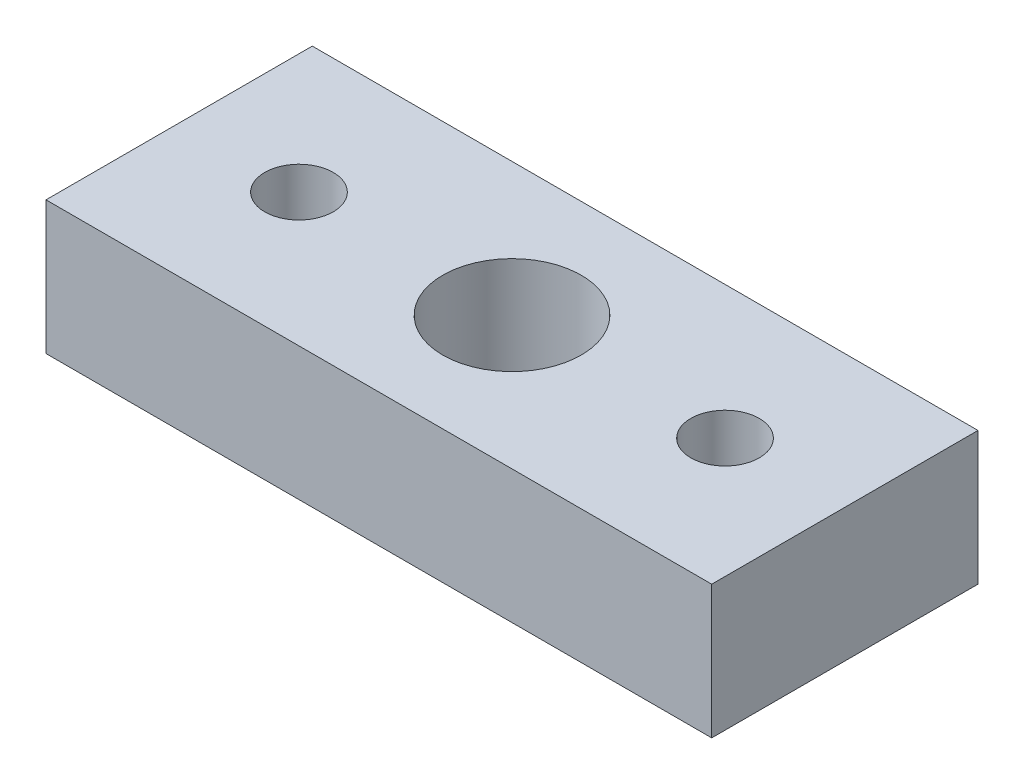
ISO-10303-21;
HEADER;
FILE_DESCRIPTION(('STEP AP214'),'2;1');
FILE_NAME('part.step','',(''),(''),'','','');
FILE_SCHEMA(('AUTOMOTIVE_DESIGN { 1 0 10303 214 1 1 1 1 }'));
ENDSEC;
DATA;
#1=APPLICATION_CONTEXT('core data for automotive mechanical design processes');
#2=APPLICATION_PROTOCOL_DEFINITION('international standard','automotive_design',2000,#1);
#3=PRODUCT_CONTEXT('',#1,'mechanical');
#4=PRODUCT('Part','Part','',(#3));
#5=PRODUCT_RELATED_PRODUCT_CATEGORY('part','',(#4));
#6=PRODUCT_DEFINITION_FORMATION('','',#4);
#7=PRODUCT_DEFINITION_CONTEXT('part definition',#1,'design');
#8=PRODUCT_DEFINITION('design','',#6,#7);
#9=PRODUCT_DEFINITION_SHAPE('','',#8);
#10=(LENGTH_UNIT() NAMED_UNIT(*) SI_UNIT(.MILLI.,.METRE.));
#11=(NAMED_UNIT(*) PLANE_ANGLE_UNIT() SI_UNIT($,.RADIAN.));
#12=(NAMED_UNIT(*) SI_UNIT($,.STERADIAN.) SOLID_ANGLE_UNIT());
#13=UNCERTAINTY_MEASURE_WITH_UNIT(LENGTH_MEASURE(1.E-05),#10,'distance_accuracy_value','');
#14=(GEOMETRIC_REPRESENTATION_CONTEXT(3) GLOBAL_UNCERTAINTY_ASSIGNED_CONTEXT((#13)) GLOBAL_UNIT_ASSIGNED_CONTEXT((#10,
#11,#12)) REPRESENTATION_CONTEXT('',''));
#15=CARTESIAN_POINT('',(0.,0.,0.));
#16=DIRECTION('',(0.,0.,1.));
#17=DIRECTION('',(1.,0.,0.));
#18=AXIS2_PLACEMENT_3D('',#15,#16,#17);
#19=CARTESIAN_POINT('',(15.875,6.35,-6.35));
#20=DIRECTION('',(-1.,0.,0.));
#21=DIRECTION('',(0.,0.,1.));
#22=AXIS2_PLACEMENT_3D('',#19,#20,#21);
#23=PLANE('',#22);
#24=DIRECTION('',(0.,0.,-1.));
#25=VECTOR('',#24,1.);
#26=CARTESIAN_POINT('',(15.875,0.,-6.35));
#27=LINE('',#26,#25);
#28=CARTESIAN_POINT('',(15.875,0.,6.35));
#29=VERTEX_POINT('',#28);
#30=CARTESIAN_POINT('',(15.875,0.,-6.35));
#31=VERTEX_POINT('',#30);
#32=EDGE_CURVE('E119',#29,#31,#27,.T.);
#33=ORIENTED_EDGE('',*,*,#32,.T.);
#34=DIRECTION('',(0.,-1.,0.));
#35=VECTOR('',#34,1.);
#36=CARTESIAN_POINT('',(15.875,6.35,-6.35));
#37=LINE('',#36,#35);
#38=CARTESIAN_POINT('',(15.875,6.35,-6.35));
#39=VERTEX_POINT('',#38);
#40=EDGE_CURVE('E11',#39,#31,#37,.T.);
#41=ORIENTED_EDGE('',*,*,#40,.F.);
#42=DIRECTION('',(0.,0.,-1.));
#43=VECTOR('',#42,1.);
#44=CARTESIAN_POINT('',(15.875,6.35,-6.35));
#45=LINE('',#44,#43);
#46=CARTESIAN_POINT('',(15.875,6.35,6.35));
#47=VERTEX_POINT('',#46);
#48=EDGE_CURVE('E102',#47,#39,#45,.T.);
#49=ORIENTED_EDGE('',*,*,#48,.F.);
#50=DIRECTION('',(0.,-1.,0.));
#51=VECTOR('',#50,1.);
#52=CARTESIAN_POINT('',(15.875,6.35,6.35));
#53=LINE('',#52,#51);
#54=EDGE_CURVE('E115',#47,#29,#53,.T.);
#55=ORIENTED_EDGE('',*,*,#54,.T.);
#56=EDGE_LOOP('',(#33,#41,#49,#55));
#57=FACE_BOUND('',#56,.T.);
#58=ADVANCED_FACE('F42',(#57),#23,.F.);
#59=CARTESIAN_POINT('',(-15.875,6.35,-6.35));
#60=DIRECTION('',(0.,0.,1.));
#61=DIRECTION('',(1.,0.,0.));
#62=AXIS2_PLACEMENT_3D('',#59,#60,#61);
#63=PLANE('',#62);
#64=DIRECTION('',(-1.,0.,0.));
#65=VECTOR('',#64,1.);
#66=CARTESIAN_POINT('',(-15.875,0.,-6.35));
#67=LINE('',#66,#65);
#68=CARTESIAN_POINT('',(-15.875,0.,-6.35));
#69=VERTEX_POINT('',#68);
#70=EDGE_CURVE('E107',#31,#69,#67,.T.);
#71=ORIENTED_EDGE('',*,*,#70,.T.);
#72=DIRECTION('',(0.,-1.,0.));
#73=VECTOR('',#72,1.);
#74=CARTESIAN_POINT('',(-15.875,6.35,-6.35));
#75=LINE('',#74,#73);
#76=CARTESIAN_POINT('',(-15.875,6.35,-6.35));
#77=VERTEX_POINT('',#76);
#78=EDGE_CURVE('E51',#77,#69,#75,.T.);
#79=ORIENTED_EDGE('',*,*,#78,.F.);
#80=DIRECTION('',(-1.,0.,0.));
#81=VECTOR('',#80,1.);
#82=CARTESIAN_POINT('',(-15.875,6.35,-6.35));
#83=LINE('',#82,#81);
#84=EDGE_CURVE('E97',#39,#77,#83,.T.);
#85=ORIENTED_EDGE('',*,*,#84,.F.);
#86=ORIENTED_EDGE('',*,*,#40,.T.);
#87=EDGE_LOOP('',(#71,#79,#85,#86));
#88=FACE_BOUND('',#87,.T.);
#89=ADVANCED_FACE('F106',(#88),#63,.F.);
#90=CARTESIAN_POINT('',(-15.875,6.35,-6.35));
#91=DIRECTION('',(1.,0.,0.));
#92=DIRECTION('',(0.,0.,-1.));
#93=AXIS2_PLACEMENT_3D('',#90,#91,#92);
#94=PLANE('',#93);
#95=DIRECTION('',(0.,0.,1.));
#96=VECTOR('',#95,1.);
#97=CARTESIAN_POINT('',(-15.875,0.,-6.35));
#98=LINE('',#97,#96);
#99=CARTESIAN_POINT('',(-15.875,0.,6.35));
#100=VERTEX_POINT('',#99);
#101=EDGE_CURVE('E83',#69,#100,#98,.T.);
#102=ORIENTED_EDGE('',*,*,#101,.T.);
#103=DIRECTION('',(0.,-1.,0.));
#104=VECTOR('',#103,1.);
#105=CARTESIAN_POINT('',(-15.875,6.35,6.35));
#106=LINE('',#105,#104);
#107=CARTESIAN_POINT('',(-15.875,6.35,6.35));
#108=VERTEX_POINT('',#107);
#109=EDGE_CURVE('E109',#108,#100,#106,.T.);
#110=ORIENTED_EDGE('',*,*,#109,.F.);
#111=DIRECTION('',(0.,0.,1.));
#112=VECTOR('',#111,1.);
#113=CARTESIAN_POINT('',(-15.875,6.35,-6.35));
#114=LINE('',#113,#112);
#115=EDGE_CURVE('E100',#77,#108,#114,.T.);
#116=ORIENTED_EDGE('',*,*,#115,.F.);
#117=ORIENTED_EDGE('',*,*,#78,.T.);
#118=EDGE_LOOP('',(#102,#110,#116,#117));
#119=FACE_BOUND('',#118,.T.);
#120=ADVANCED_FACE('F110',(#119),#94,.F.);
#121=CARTESIAN_POINT('',(-15.875,6.35,6.35));
#122=DIRECTION('',(0.,0.,-1.));
#123=DIRECTION('',(-1.,0.,0.));
#124=AXIS2_PLACEMENT_3D('',#121,#122,#123);
#125=PLANE('',#124);
#126=DIRECTION('',(1.,0.,0.));
#127=VECTOR('',#126,1.);
#128=CARTESIAN_POINT('',(-15.875,0.,6.35));
#129=LINE('',#128,#127);
#130=EDGE_CURVE('E89',#100,#29,#129,.T.);
#131=ORIENTED_EDGE('',*,*,#130,.T.);
#132=ORIENTED_EDGE('',*,*,#54,.F.);
#133=DIRECTION('',(1.,0.,0.));
#134=VECTOR('',#133,1.);
#135=CARTESIAN_POINT('',(-15.875,6.35,6.35));
#136=LINE('',#135,#134);
#137=EDGE_CURVE('E62',#108,#47,#136,.T.);
#138=ORIENTED_EDGE('',*,*,#137,.F.);
#139=ORIENTED_EDGE('',*,*,#109,.T.);
#140=EDGE_LOOP('',(#131,#132,#138,#139));
#141=FACE_BOUND('',#140,.T.);
#142=ADVANCED_FACE('F132',(#141),#125,.F.);
#143=CARTESIAN_POINT('',(0.,6.35,0.));
#144=DIRECTION('',(0.,1.,0.));
#145=DIRECTION('',(0.,0.,1.));
#146=AXIS2_PLACEMENT_3D('',#143,#144,#145);
#147=PLANE('',#146);
#148=CARTESIAN_POINT('',(10.16,6.35,0.));
#149=DIRECTION('',(0.,1.,0.));
#150=DIRECTION('',(0.,0.,1.));
#151=AXIS2_PLACEMENT_3D('',#148,#149,#150);
#152=CIRCLE('',#151,1.63194999999999);
#153=CARTESIAN_POINT('',(10.16,6.35,1.63194999999999));
#154=VERTEX_POINT('',#153);
#155=EDGE_CURVE('E158',#154,#154,#152,.T.);
#156=ORIENTED_EDGE('',*,*,#155,.F.);
#157=EDGE_LOOP('',(#156));
#158=FACE_BOUND('',#157,.T.);
#159=CARTESIAN_POINT('',(-10.16,6.35,0.));
#160=DIRECTION('',(0.,1.,0.));
#161=DIRECTION('',(0.,0.,1.));
#162=AXIS2_PLACEMENT_3D('',#159,#160,#161);
#163=CIRCLE('',#162,1.63194999999999);
#164=CARTESIAN_POINT('',(-10.16,6.35,1.63194999999999));
#165=VERTEX_POINT('',#164);
#166=EDGE_CURVE('E151',#165,#165,#163,.T.);
#167=ORIENTED_EDGE('',*,*,#166,.F.);
#168=EDGE_LOOP('',(#167));
#169=FACE_BOUND('',#168,.T.);
#170=CARTESIAN_POINT('',(0.,6.35,0.));
#171=DIRECTION('',(0.,1.,0.));
#172=DIRECTION('',(0.,0.,1.));
#173=AXIS2_PLACEMENT_3D('',#170,#171,#172);
#174=CIRCLE('',#173,3.302);
#175=CARTESIAN_POINT('',(0.,6.35,3.302));
#176=VERTEX_POINT('',#175);
#177=EDGE_CURVE('E143',#176,#176,#174,.T.);
#178=ORIENTED_EDGE('',*,*,#177,.F.);
#179=EDGE_LOOP('',(#178));
#180=FACE_BOUND('',#179,.T.);
#181=ORIENTED_EDGE('',*,*,#48,.T.);
#182=ORIENTED_EDGE('',*,*,#84,.T.);
#183=ORIENTED_EDGE('',*,*,#115,.T.);
#184=ORIENTED_EDGE('',*,*,#137,.T.);
#185=EDGE_LOOP('',(#181,#182,#183,#184));
#186=FACE_BOUND('',#185,.T.);
#187=ADVANCED_FACE('F98',(#158,#169,#180,#186),#147,.T.);
#188=CARTESIAN_POINT('',(0.,0.,0.));
#189=DIRECTION('',(0.,1.,0.));
#190=DIRECTION('',(0.,0.,1.));
#191=AXIS2_PLACEMENT_3D('',#188,#189,#190);
#192=PLANE('',#191);
#193=CARTESIAN_POINT('',(10.16,0.,0.));
#194=DIRECTION('',(0.,1.,0.));
#195=DIRECTION('',(0.,0.,1.));
#196=AXIS2_PLACEMENT_3D('',#193,#194,#195);
#197=CIRCLE('',#196,1.63194999999999);
#198=CARTESIAN_POINT('',(10.16,0.,1.63194999999999));
#199=VERTEX_POINT('',#198);
#200=EDGE_CURVE('E155',#199,#199,#197,.T.);
#201=ORIENTED_EDGE('',*,*,#200,.T.);
#202=EDGE_LOOP('',(#201));
#203=FACE_BOUND('',#202,.T.);
#204=CARTESIAN_POINT('',(-10.16,0.,0.));
#205=DIRECTION('',(0.,1.,0.));
#206=DIRECTION('',(0.,0.,1.));
#207=AXIS2_PLACEMENT_3D('',#204,#205,#206);
#208=CIRCLE('',#207,1.63194999999999);
#209=CARTESIAN_POINT('',(-10.16,0.,1.63194999999999));
#210=VERTEX_POINT('',#209);
#211=EDGE_CURVE('E147',#210,#210,#208,.T.);
#212=ORIENTED_EDGE('',*,*,#211,.T.);
#213=EDGE_LOOP('',(#212));
#214=FACE_BOUND('',#213,.T.);
#215=CARTESIAN_POINT('',(0.,0.,0.));
#216=DIRECTION('',(0.,1.,0.));
#217=DIRECTION('',(0.,0.,1.));
#218=AXIS2_PLACEMENT_3D('',#215,#216,#217);
#219=CIRCLE('',#218,3.302);
#220=CARTESIAN_POINT('',(0.,0.,3.302));
#221=VERTEX_POINT('',#220);
#222=EDGE_CURVE('E123',#221,#221,#219,.F.);
#223=ORIENTED_EDGE('',*,*,#222,.F.);
#224=EDGE_LOOP('',(#223));
#225=FACE_BOUND('',#224,.T.);
#226=ORIENTED_EDGE('',*,*,#32,.F.);
#227=ORIENTED_EDGE('',*,*,#130,.F.);
#228=ORIENTED_EDGE('',*,*,#101,.F.);
#229=ORIENTED_EDGE('',*,*,#70,.F.);
#230=EDGE_LOOP('',(#226,#227,#228,#229));
#231=FACE_BOUND('',#230,.T.);
#232=ADVANCED_FACE('F135',(#203,#214,#225,#231),#192,.F.);
#233=CARTESIAN_POINT('',(0.,-0.00100000000000013,0.));
#234=DIRECTION('',(0.,1.,0.));
#235=DIRECTION('',(0.,0.,1.));
#236=AXIS2_PLACEMENT_3D('',#233,#234,#235);
#237=CYLINDRICAL_SURFACE('',#236,3.302);
#238=ORIENTED_EDGE('',*,*,#177,.T.);
#239=EDGE_LOOP('',(#238));
#240=FACE_BOUND('',#239,.T.);
#241=ORIENTED_EDGE('',*,*,#222,.T.);
#242=EDGE_LOOP('',(#241));
#243=FACE_BOUND('',#242,.T.);
#244=ADVANCED_FACE('F172',(#240,#243),#237,.F.);
#245=CARTESIAN_POINT('',(-10.16,6.35,0.));
#246=DIRECTION('',(0.,1.,0.));
#247=DIRECTION('',(0.,0.,1.));
#248=AXIS2_PLACEMENT_3D('',#245,#246,#247);
#249=CYLINDRICAL_SURFACE('',#248,1.63194999999999);
#250=ORIENTED_EDGE('',*,*,#211,.F.);
#251=EDGE_LOOP('',(#250));
#252=FACE_BOUND('',#251,.T.);
#253=ORIENTED_EDGE('',*,*,#166,.T.);
#254=EDGE_LOOP('',(#253));
#255=FACE_BOUND('',#254,.T.);
#256=ADVANCED_FACE('F175',(#252,#255),#249,.F.);
#257=CARTESIAN_POINT('',(10.16,6.35,0.));
#258=DIRECTION('',(0.,1.,0.));
#259=DIRECTION('',(0.,0.,1.));
#260=AXIS2_PLACEMENT_3D('',#257,#258,#259);
#261=CYLINDRICAL_SURFACE('',#260,1.63194999999999);
#262=ORIENTED_EDGE('',*,*,#200,.F.);
#263=EDGE_LOOP('',(#262));
#264=FACE_BOUND('',#263,.T.);
#265=ORIENTED_EDGE('',*,*,#155,.T.);
#266=EDGE_LOOP('',(#265));
#267=FACE_BOUND('',#266,.T.);
#268=ADVANCED_FACE('F163',(#264,#267),#261,.F.);
#269=CLOSED_SHELL('',(#58,#89,#120,#142,#187,#232,#244,#256,#268));
#270=MANIFOLD_SOLID_BREP('B2',#269);
#271=ADVANCED_BREP_SHAPE_REPRESENTATION('',(#18,#270),#14);
#272=SHAPE_DEFINITION_REPRESENTATION(#9,#271);
ENDSEC;
END-ISO-10303-21;
